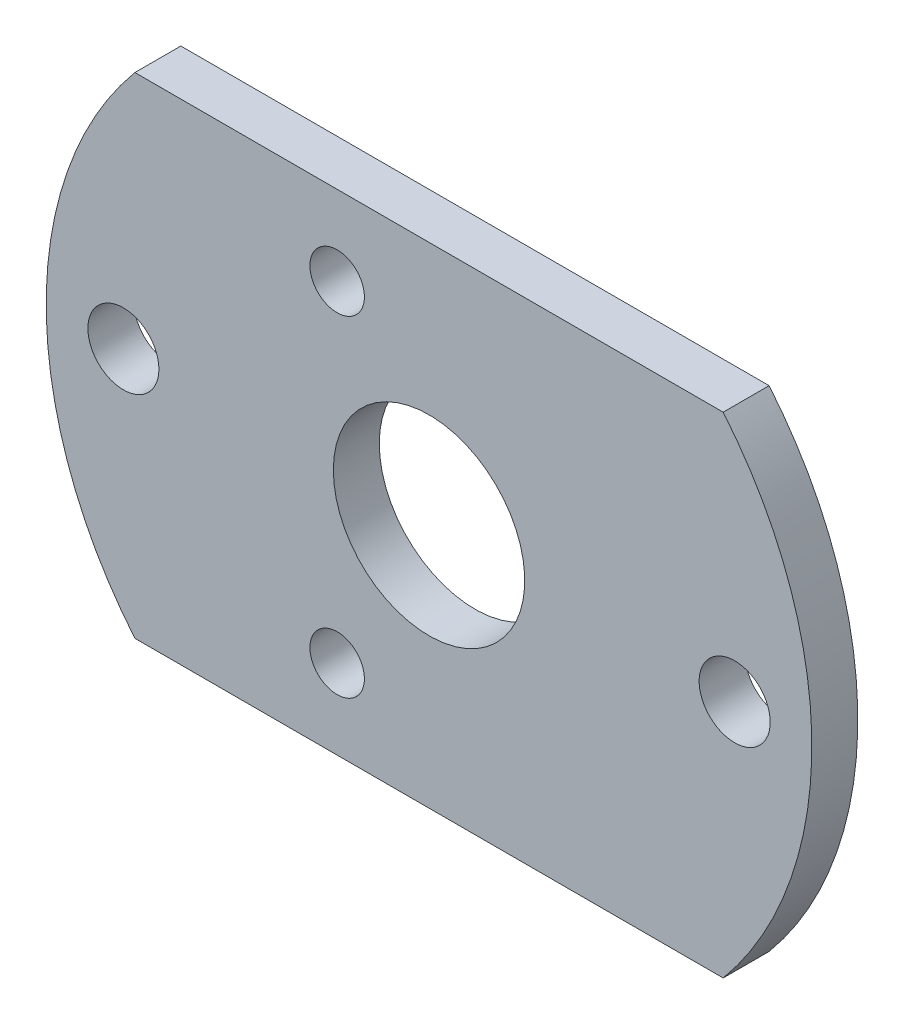
ISO-10303-21;
HEADER;
FILE_DESCRIPTION(('STEP AP214'),'2;1');
FILE_NAME('part.step','',(''),(''),'','','');
FILE_SCHEMA(('AUTOMOTIVE_DESIGN { 1 0 10303 214 1 1 1 1 }'));
ENDSEC;
DATA;
#1=APPLICATION_CONTEXT('core data for automotive mechanical design processes');
#2=APPLICATION_PROTOCOL_DEFINITION('international standard','automotive_design',2000,#1);
#3=PRODUCT_CONTEXT('',#1,'mechanical');
#4=PRODUCT('Part','Part','',(#3));
#5=PRODUCT_RELATED_PRODUCT_CATEGORY('part','',(#4));
#6=PRODUCT_DEFINITION_FORMATION('','',#4);
#7=PRODUCT_DEFINITION_CONTEXT('part definition',#1,'design');
#8=PRODUCT_DEFINITION('design','',#6,#7);
#9=PRODUCT_DEFINITION_SHAPE('','',#8);
#10=(LENGTH_UNIT() NAMED_UNIT(*) SI_UNIT(.MILLI.,.METRE.));
#11=(NAMED_UNIT(*) PLANE_ANGLE_UNIT() SI_UNIT($,.RADIAN.));
#12=(NAMED_UNIT(*) SI_UNIT($,.STERADIAN.) SOLID_ANGLE_UNIT());
#13=UNCERTAINTY_MEASURE_WITH_UNIT(LENGTH_MEASURE(1.E-05),#10,'distance_accuracy_value','');
#14=(GEOMETRIC_REPRESENTATION_CONTEXT(3) GLOBAL_UNCERTAINTY_ASSIGNED_CONTEXT((#13)) GLOBAL_UNIT_ASSIGNED_CONTEXT((#10,
#11,#12)) REPRESENTATION_CONTEXT('',''));
#15=CARTESIAN_POINT('',(0.,0.,0.));
#16=DIRECTION('',(0.,0.,1.));
#17=DIRECTION('',(1.,0.,0.));
#18=AXIS2_PLACEMENT_3D('',#15,#16,#17);
#19=CARTESIAN_POINT('',(0.,0.,1.905));
#20=DIRECTION('',(0.,0.,-1.));
#21=DIRECTION('',(-1.,0.,0.));
#22=AXIS2_PLACEMENT_3D('',#19,#20,#21);
#23=CYLINDRICAL_SURFACE('',#22,15.875);
#24=CARTESIAN_POINT('',(0.,0.,1.905));
#25=DIRECTION('',(0.,0.,1.));
#26=DIRECTION('',(1.,0.,0.));
#27=AXIS2_PLACEMENT_3D('',#24,#25,#26);
#28=CIRCLE('',#27,15.875);
#29=CARTESIAN_POINT('',(-12.1979516723096,10.16,1.905));
#30=VERTEX_POINT('',#29);
#31=CARTESIAN_POINT('',(-12.1979516723096,-10.16,1.905));
#32=VERTEX_POINT('',#31);
#33=EDGE_CURVE('E44',#30,#32,#28,.T.);
#34=ORIENTED_EDGE('',*,*,#33,.F.);
#35=DIRECTION('',(0.,0.,1.));
#36=VECTOR('',#35,1.);
#37=CARTESIAN_POINT('',(-12.1979516723096,10.16,0.));
#38=LINE('',#37,#36);
#39=CARTESIAN_POINT('',(-12.1979516723096,10.16,0.));
#40=VERTEX_POINT('',#39);
#41=EDGE_CURVE('E78',#40,#30,#38,.T.);
#42=ORIENTED_EDGE('',*,*,#41,.F.);
#43=CARTESIAN_POINT('',(0.,0.,0.));
#44=DIRECTION('',(0.,0.,1.));
#45=DIRECTION('',(1.,0.,0.));
#46=AXIS2_PLACEMENT_3D('',#43,#44,#45);
#47=CIRCLE('',#46,15.875);
#48=CARTESIAN_POINT('',(-12.1979516723096,-10.16,0.));
#49=VERTEX_POINT('',#48);
#50=EDGE_CURVE('E87',#40,#49,#47,.T.);
#51=ORIENTED_EDGE('',*,*,#50,.T.);
#52=DIRECTION('',(0.,0.,1.));
#53=VECTOR('',#52,1.);
#54=CARTESIAN_POINT('',(-12.1979516723096,-10.16,0.));
#55=LINE('',#54,#53);
#56=EDGE_CURVE('E127',#49,#32,#55,.T.);
#57=ORIENTED_EDGE('',*,*,#56,.T.);
#58=EDGE_LOOP('',(#34,#42,#51,#57));
#59=FACE_BOUND('',#58,.T.);
#60=ADVANCED_FACE('F35',(#59),#23,.T.);
#61=CARTESIAN_POINT('',(0.,0.,1.905));
#62=DIRECTION('',(0.,0.,1.));
#63=DIRECTION('',(1.,0.,0.));
#64=AXIS2_PLACEMENT_3D('',#61,#62,#63);
#65=PLANE('',#64);
#66=DIRECTION('',(1.,0.,0.));
#67=VECTOR('',#66,1.);
#68=CARTESIAN_POINT('',(-12.1979516723096,10.16,1.905));
#69=LINE('',#68,#67);
#70=CARTESIAN_POINT('',(12.1979516723096,10.16,1.905));
#71=VERTEX_POINT('',#70);
#72=EDGE_CURVE('E51',#30,#71,#69,.T.);
#73=ORIENTED_EDGE('',*,*,#72,.F.);
#74=ORIENTED_EDGE('',*,*,#33,.T.);
#75=DIRECTION('',(-1.,0.,0.));
#76=VECTOR('',#75,1.);
#77=CARTESIAN_POINT('',(-12.1979516723096,-10.16,1.905));
#78=LINE('',#77,#76);
#79=CARTESIAN_POINT('',(12.1979516723096,-10.16,1.905));
#80=VERTEX_POINT('',#79);
#81=EDGE_CURVE('E131',#80,#32,#78,.T.);
#82=ORIENTED_EDGE('',*,*,#81,.F.);
#83=EDGE_CURVE('E11',#80,#71,#28,.T.);
#84=ORIENTED_EDGE('',*,*,#83,.T.);
#85=EDGE_LOOP('',(#73,#74,#82,#84));
#86=FACE_BOUND('',#85,.T.);
#87=CARTESIAN_POINT('',(-3.81,6.858,1.905));
#88=DIRECTION('',(0.,0.,1.));
#89=DIRECTION('',(1.,0.,0.));
#90=AXIS2_PLACEMENT_3D('',#87,#88,#89);
#91=CIRCLE('',#90,1.13029999999999);
#92=CARTESIAN_POINT('',(-2.67970000000001,6.858,1.905));
#93=VERTEX_POINT('',#92);
#94=EDGE_CURVE('E124',#93,#93,#91,.T.);
#95=ORIENTED_EDGE('',*,*,#94,.F.);
#96=EDGE_LOOP('',(#95));
#97=FACE_BOUND('',#96,.T.);
#98=CARTESIAN_POINT('',(-3.81,-6.858,1.905));
#99=DIRECTION('',(0.,0.,1.));
#100=DIRECTION('',(1.,0.,0.));
#101=AXIS2_PLACEMENT_3D('',#98,#99,#100);
#102=CIRCLE('',#101,1.13029999999999);
#103=CARTESIAN_POINT('',(-2.67970000000001,-6.858,1.905));
#104=VERTEX_POINT('',#103);
#105=EDGE_CURVE('E118',#104,#104,#102,.T.);
#106=ORIENTED_EDGE('',*,*,#105,.F.);
#107=EDGE_LOOP('',(#106));
#108=FACE_BOUND('',#107,.T.);
#109=CARTESIAN_POINT('',(-12.6746,0.,1.905));
#110=DIRECTION('',(0.,0.,1.));
#111=DIRECTION('',(1.,0.,0.));
#112=AXIS2_PLACEMENT_3D('',#109,#110,#111);
#113=CIRCLE('',#112,1.47319999999999);
#114=CARTESIAN_POINT('',(-11.2014,0.,1.905));
#115=VERTEX_POINT('',#114);
#116=EDGE_CURVE('E112',#115,#115,#113,.T.);
#117=ORIENTED_EDGE('',*,*,#116,.F.);
#118=EDGE_LOOP('',(#117));
#119=FACE_BOUND('',#118,.T.);
#120=CARTESIAN_POINT('',(12.6746,0.,1.905));
#121=DIRECTION('',(0.,0.,1.));
#122=DIRECTION('',(1.,0.,0.));
#123=AXIS2_PLACEMENT_3D('',#120,#121,#122);
#124=CIRCLE('',#123,1.47319999999999);
#125=CARTESIAN_POINT('',(14.1478,0.,1.905));
#126=VERTEX_POINT('',#125);
#127=EDGE_CURVE('E106',#126,#126,#124,.T.);
#128=ORIENTED_EDGE('',*,*,#127,.F.);
#129=EDGE_LOOP('',(#128));
#130=FACE_BOUND('',#129,.T.);
#131=CARTESIAN_POINT('',(0.,0.,1.905));
#132=DIRECTION('',(0.,0.,1.));
#133=DIRECTION('',(1.,0.,0.));
#134=AXIS2_PLACEMENT_3D('',#131,#132,#133);
#135=CIRCLE('',#134,3.96875);
#136=CARTESIAN_POINT('',(-3.96875,0.,1.905));
#137=VERTEX_POINT('',#136);
#138=EDGE_CURVE('E94',#137,#137,#135,.T.);
#139=ORIENTED_EDGE('',*,*,#138,.F.);
#140=EDGE_LOOP('',(#139));
#141=FACE_BOUND('',#140,.T.);
#142=ADVANCED_FACE('F138',(#86,#97,#108,#119,#130,#141),#65,.T.);
#143=CARTESIAN_POINT('',(0.,0.,0.));
#144=DIRECTION('',(0.,0.,1.));
#145=DIRECTION('',(1.,0.,0.));
#146=AXIS2_PLACEMENT_3D('',#143,#144,#145);
#147=PLANE('',#146);
#148=CARTESIAN_POINT('',(-3.81,6.858,0.));
#149=DIRECTION('',(0.,0.,1.));
#150=DIRECTION('',(1.,0.,0.));
#151=AXIS2_PLACEMENT_3D('',#148,#149,#150);
#152=CIRCLE('',#151,1.1303);
#153=CARTESIAN_POINT('',(-2.6797,6.858,0.));
#154=VERTEX_POINT('',#153);
#155=EDGE_CURVE('E121',#154,#154,#152,.T.);
#156=ORIENTED_EDGE('',*,*,#155,.T.);
#157=EDGE_LOOP('',(#156));
#158=FACE_BOUND('',#157,.T.);
#159=CARTESIAN_POINT('',(-3.81,-6.858,0.));
#160=DIRECTION('',(0.,0.,1.));
#161=DIRECTION('',(1.,0.,0.));
#162=AXIS2_PLACEMENT_3D('',#159,#160,#161);
#163=CIRCLE('',#162,1.1303);
#164=CARTESIAN_POINT('',(-2.6797,-6.858,0.));
#165=VERTEX_POINT('',#164);
#166=EDGE_CURVE('E115',#165,#165,#163,.T.);
#167=ORIENTED_EDGE('',*,*,#166,.T.);
#168=EDGE_LOOP('',(#167));
#169=FACE_BOUND('',#168,.T.);
#170=CARTESIAN_POINT('',(-12.6746,0.,0.));
#171=DIRECTION('',(0.,0.,1.));
#172=DIRECTION('',(1.,0.,0.));
#173=AXIS2_PLACEMENT_3D('',#170,#171,#172);
#174=CIRCLE('',#173,1.4732);
#175=CARTESIAN_POINT('',(-11.2014,0.,0.));
#176=VERTEX_POINT('',#175);
#177=EDGE_CURVE('E109',#176,#176,#174,.T.);
#178=ORIENTED_EDGE('',*,*,#177,.T.);
#179=EDGE_LOOP('',(#178));
#180=FACE_BOUND('',#179,.T.);
#181=CARTESIAN_POINT('',(12.6746,0.,0.));
#182=DIRECTION('',(0.,0.,1.));
#183=DIRECTION('',(1.,0.,0.));
#184=AXIS2_PLACEMENT_3D('',#181,#182,#183);
#185=CIRCLE('',#184,1.4732);
#186=CARTESIAN_POINT('',(14.1478,0.,0.));
#187=VERTEX_POINT('',#186);
#188=EDGE_CURVE('E101',#187,#187,#185,.T.);
#189=ORIENTED_EDGE('',*,*,#188,.T.);
#190=EDGE_LOOP('',(#189));
#191=FACE_BOUND('',#190,.T.);
#192=ORIENTED_EDGE('',*,*,#50,.F.);
#193=DIRECTION('',(1.,0.,0.));
#194=VECTOR('',#193,1.);
#195=CARTESIAN_POINT('',(-12.1979516723096,10.16,0.));
#196=LINE('',#195,#194);
#197=CARTESIAN_POINT('',(12.1979516723096,10.16,0.));
#198=VERTEX_POINT('',#197);
#199=EDGE_CURVE('E75',#40,#198,#196,.T.);
#200=ORIENTED_EDGE('',*,*,#199,.T.);
#201=CARTESIAN_POINT('',(12.1979516723096,-10.16,0.));
#202=VERTEX_POINT('',#201);
#203=EDGE_CURVE('E39',#202,#198,#47,.T.);
#204=ORIENTED_EDGE('',*,*,#203,.F.);
#205=DIRECTION('',(-1.,0.,0.));
#206=VECTOR('',#205,1.);
#207=CARTESIAN_POINT('',(-12.1979516723096,-10.16,0.));
#208=LINE('',#207,#206);
#209=EDGE_CURVE('E93',#202,#49,#208,.T.);
#210=ORIENTED_EDGE('',*,*,#209,.T.);
#211=EDGE_LOOP('',(#192,#200,#204,#210));
#212=FACE_BOUND('',#211,.T.);
#213=CARTESIAN_POINT('',(0.,0.,0.));
#214=DIRECTION('',(0.,0.,1.));
#215=DIRECTION('',(1.,0.,0.));
#216=AXIS2_PLACEMENT_3D('',#213,#214,#215);
#217=CIRCLE('',#216,3.96875);
#218=CARTESIAN_POINT('',(-3.96875,0.,0.));
#219=VERTEX_POINT('',#218);
#220=EDGE_CURVE('E96',#219,#219,#217,.T.);
#221=ORIENTED_EDGE('',*,*,#220,.T.);
#222=EDGE_LOOP('',(#221));
#223=FACE_BOUND('',#222,.T.);
#224=ADVANCED_FACE('F91',(#158,#169,#180,#191,#212,#223),#147,.F.);
#225=ORIENTED_EDGE('',*,*,#203,.T.);
#226=DIRECTION('',(0.,0.,1.));
#227=VECTOR('',#226,1.);
#228=CARTESIAN_POINT('',(12.1979516723096,10.16,0.));
#229=LINE('',#228,#227);
#230=EDGE_CURVE('E79',#198,#71,#229,.T.);
#231=ORIENTED_EDGE('',*,*,#230,.T.);
#232=ORIENTED_EDGE('',*,*,#83,.F.);
#233=DIRECTION('',(0.,0.,1.));
#234=VECTOR('',#233,1.);
#235=CARTESIAN_POINT('',(12.1979516723096,-10.16,0.));
#236=LINE('',#235,#234);
#237=EDGE_CURVE('E128',#202,#80,#236,.T.);
#238=ORIENTED_EDGE('',*,*,#237,.F.);
#239=EDGE_LOOP('',(#225,#231,#232,#238));
#240=FACE_BOUND('',#239,.T.);
#241=ADVANCED_FACE('F37',(#240),#23,.T.);
#242=CARTESIAN_POINT('',(0.,0.,1.905));
#243=DIRECTION('',(0.,0.,-1.));
#244=DIRECTION('',(-1.,0.,0.));
#245=AXIS2_PLACEMENT_3D('',#242,#243,#244);
#246=CYLINDRICAL_SURFACE('',#245,3.96875);
#247=CARTESIAN_POINT('',(-3.96875,0.,1.905));
#248=CARTESIAN_POINT('',(-3.96875,0.,1.88515625));
#249=CARTESIAN_POINT('',(-3.96875,0.,1.8653125));
#250=CARTESIAN_POINT('',(-3.96875,0.,1.825625));
#251=CARTESIAN_POINT('',(-3.96875,0.,1.80578125));
#252=CARTESIAN_POINT('',(-3.96875,0.,1.76609375));
#253=CARTESIAN_POINT('',(-3.96875,0.,1.74625));
#254=CARTESIAN_POINT('',(-3.96875,0.,1.7065625));
#255=CARTESIAN_POINT('',(-3.96875,0.,1.68671875));
#256=CARTESIAN_POINT('',(-3.96875,0.,1.64703125));
#257=CARTESIAN_POINT('',(-3.96875,0.,1.6271875));
#258=CARTESIAN_POINT('',(-3.96875,0.,1.5875));
#259=CARTESIAN_POINT('',(-3.96875,0.,1.56765625));
#260=CARTESIAN_POINT('',(-3.96875,0.,1.52796875));
#261=CARTESIAN_POINT('',(-3.96875,0.,1.508125));
#262=CARTESIAN_POINT('',(-3.96875,0.,1.4684375));
#263=CARTESIAN_POINT('',(-3.96875,0.,1.44859375));
#264=CARTESIAN_POINT('',(-3.96875,0.,1.40890625));
#265=CARTESIAN_POINT('',(-3.96875,0.,1.3890625));
#266=CARTESIAN_POINT('',(-3.96875,0.,1.349375));
#267=CARTESIAN_POINT('',(-3.96875,0.,1.32953125));
#268=CARTESIAN_POINT('',(-3.96875,0.,1.28984375));
#269=CARTESIAN_POINT('',(-3.96875,0.,1.27));
#270=CARTESIAN_POINT('',(-3.96875,0.,1.2303125));
#271=CARTESIAN_POINT('',(-3.96875,0.,1.21046875));
#272=CARTESIAN_POINT('',(-3.96875,0.,1.17078125));
#273=CARTESIAN_POINT('',(-3.96875,0.,1.1509375));
#274=CARTESIAN_POINT('',(-3.96875,0.,1.11125));
#275=CARTESIAN_POINT('',(-3.96875,0.,1.09140625));
#276=CARTESIAN_POINT('',(-3.96875,0.,1.05171875));
#277=CARTESIAN_POINT('',(-3.96875,0.,1.031875));
#278=CARTESIAN_POINT('',(-3.96875,0.,0.9921875));
#279=CARTESIAN_POINT('',(-3.96875,0.,0.97234375));
#280=CARTESIAN_POINT('',(-3.96875,0.,0.93265625));
#281=CARTESIAN_POINT('',(-3.96875,0.,0.9128125));
#282=CARTESIAN_POINT('',(-3.96875,0.,0.873125));
#283=CARTESIAN_POINT('',(-3.96875,0.,0.85328125));
#284=CARTESIAN_POINT('',(-3.96875,0.,0.81359375));
#285=CARTESIAN_POINT('',(-3.96875,0.,0.79375));
#286=CARTESIAN_POINT('',(-3.96875,0.,0.7540625));
#287=CARTESIAN_POINT('',(-3.96875,0.,0.73421875));
#288=CARTESIAN_POINT('',(-3.96875,0.,0.69453125));
#289=CARTESIAN_POINT('',(-3.96875,0.,0.6746875));
#290=CARTESIAN_POINT('',(-3.96875,0.,0.635));
#291=CARTESIAN_POINT('',(-3.96875,0.,0.61515625));
#292=CARTESIAN_POINT('',(-3.96875,0.,0.57546875));
#293=CARTESIAN_POINT('',(-3.96875,0.,0.555625));
#294=CARTESIAN_POINT('',(-3.96875,0.,0.5159375));
#295=CARTESIAN_POINT('',(-3.96875,0.,0.49609375));
#296=CARTESIAN_POINT('',(-3.96875,0.,0.45640625));
#297=CARTESIAN_POINT('',(-3.96875,0.,0.4365625));
#298=CARTESIAN_POINT('',(-3.96875,0.,0.396875));
#299=CARTESIAN_POINT('',(-3.96875,0.,0.37703125));
#300=CARTESIAN_POINT('',(-3.96875,0.,0.33734375));
#301=CARTESIAN_POINT('',(-3.96875,0.,0.3175));
#302=CARTESIAN_POINT('',(-3.96875,0.,0.2778125));
#303=CARTESIAN_POINT('',(-3.96875,0.,0.25796875));
#304=CARTESIAN_POINT('',(-3.96875,0.,0.21828125));
#305=CARTESIAN_POINT('',(-3.96875,0.,0.1984375));
#306=CARTESIAN_POINT('',(-3.96875,0.,0.15875));
#307=CARTESIAN_POINT('',(-3.96875,0.,0.13890625));
#308=CARTESIAN_POINT('',(-3.96875,0.,0.09921875));
#309=CARTESIAN_POINT('',(-3.96875,0.,0.0793749999999999));
#310=CARTESIAN_POINT('',(-3.96875,0.,0.0396874999999999));
#311=CARTESIAN_POINT('',(-3.96875,0.,0.01984375));
#312=CARTESIAN_POINT('',(-3.96875,0.,0.));
#313=B_SPLINE_CURVE_WITH_KNOTS('',3,(#247,#248,#249,#250,#251,#252,#253,#254,#255,#256,#257,
#258,#259,#260,#261,#262,#263,#264,#265,#266,#267,#268,#269,#270,#271,#272,#273,#274,#275,#276,
#277,#278,#279,#280,#281,#282,#283,#284,#285,#286,#287,#288,#289,#290,#291,#292,#293,#294,#295,
#296,#297,#298,#299,#300,#301,#302,#303,#304,#305,#306,#307,#308,#309,#310,#311,#312),
.UNSPECIFIED.,.F.,.F.,(4,2,2,2,2,2,2,2,2,2,2,2,2,2,2,2,2,2,2,2,2,2,2,2,2,2,2,2,2,2,2,2,4),(0.,
0.0595312499999999,0.1190625,0.17859375,0.238125,0.29765625,0.3571875,0.41671875,0.47625,
0.53578125,0.5953125,0.65484375,0.714375,0.77390625,0.833437499999999,0.89296875,0.9525,
1.01203125,1.0715625,1.13109375,1.190625,1.25015625,1.3096875,1.36921875,1.42875,1.48828125,
1.5478125,1.60734375,1.666875,1.72640625,1.7859375,1.84546875,1.905),.UNSPECIFIED.);
#314=EDGE_CURVE('BSEAM159',#137,#219,#313,.T.);
#315=ORIENTED_EDGE('',*,*,#138,.T.);
#316=ORIENTED_EDGE('',*,*,#220,.F.);
#317=ORIENTED_EDGE('',*,*,#314,.T.);
#318=ORIENTED_EDGE('',*,*,#314,.F.);
#319=EDGE_LOOP('',(#315,#317,#316,#318));
#320=FACE_BOUND('',#319,.T.);
#321=ADVANCED_FACE('F159',(#320),#246,.F.);
#322=CARTESIAN_POINT('',(12.6746,0.,1.905));
#323=DIRECTION('',(0.,0.,1.));
#324=DIRECTION('',(1.,0.,0.));
#325=AXIS2_PLACEMENT_3D('',#322,#323,#324);
#326=CYLINDRICAL_SURFACE('',#325,1.47319999999999);
#327=ORIENTED_EDGE('',*,*,#188,.F.);
#328=EDGE_LOOP('',(#327));
#329=FACE_BOUND('',#328,.T.);
#330=ORIENTED_EDGE('',*,*,#127,.T.);
#331=EDGE_LOOP('',(#330));
#332=FACE_BOUND('',#331,.T.);
#333=ADVANCED_FACE('F164',(#329,#332),#326,.F.);
#334=CARTESIAN_POINT('',(-12.6746,0.,1.905));
#335=DIRECTION('',(0.,0.,1.));
#336=DIRECTION('',(1.,0.,0.));
#337=AXIS2_PLACEMENT_3D('',#334,#335,#336);
#338=CYLINDRICAL_SURFACE('',#337,1.47319999999999);
#339=ORIENTED_EDGE('',*,*,#177,.F.);
#340=EDGE_LOOP('',(#339));
#341=FACE_BOUND('',#340,.T.);
#342=ORIENTED_EDGE('',*,*,#116,.T.);
#343=EDGE_LOOP('',(#342));
#344=FACE_BOUND('',#343,.T.);
#345=ADVANCED_FACE('F173',(#341,#344),#338,.F.);
#346=CARTESIAN_POINT('',(-3.81,-6.858,1.905));
#347=DIRECTION('',(0.,0.,1.));
#348=DIRECTION('',(1.,0.,0.));
#349=AXIS2_PLACEMENT_3D('',#346,#347,#348);
#350=CYLINDRICAL_SURFACE('',#349,1.13029999999999);
#351=ORIENTED_EDGE('',*,*,#166,.F.);
#352=EDGE_LOOP('',(#351));
#353=FACE_BOUND('',#352,.T.);
#354=ORIENTED_EDGE('',*,*,#105,.T.);
#355=EDGE_LOOP('',(#354));
#356=FACE_BOUND('',#355,.T.);
#357=ADVANCED_FACE('F150',(#353,#356),#350,.F.);
#358=CARTESIAN_POINT('',(-3.81,6.858,1.905));
#359=DIRECTION('',(0.,0.,1.));
#360=DIRECTION('',(1.,0.,0.));
#361=AXIS2_PLACEMENT_3D('',#358,#359,#360);
#362=CYLINDRICAL_SURFACE('',#361,1.13029999999999);
#363=ORIENTED_EDGE('',*,*,#155,.F.);
#364=EDGE_LOOP('',(#363));
#365=FACE_BOUND('',#364,.T.);
#366=ORIENTED_EDGE('',*,*,#94,.T.);
#367=EDGE_LOOP('',(#366));
#368=FACE_BOUND('',#367,.T.);
#369=ADVANCED_FACE('F143',(#365,#368),#362,.F.);
#370=CARTESIAN_POINT('',(-12.1979516723096,-10.16,0.));
#371=DIRECTION('',(0.,1.,0.));
#372=DIRECTION('',(0.,0.,1.));
#373=AXIS2_PLACEMENT_3D('',#370,#371,#372);
#374=PLANE('',#373);
#375=ORIENTED_EDGE('',*,*,#81,.T.);
#376=ORIENTED_EDGE('',*,*,#56,.F.);
#377=ORIENTED_EDGE('',*,*,#209,.F.);
#378=ORIENTED_EDGE('',*,*,#237,.T.);
#379=EDGE_LOOP('',(#375,#376,#377,#378));
#380=FACE_BOUND('',#379,.T.);
#381=ADVANCED_FACE('F141',(#380),#374,.F.);
#382=CARTESIAN_POINT('',(-12.1979516723096,10.16,0.));
#383=DIRECTION('',(0.,-1.,0.));
#384=DIRECTION('',(0.,0.,-1.));
#385=AXIS2_PLACEMENT_3D('',#382,#383,#384);
#386=PLANE('',#385);
#387=ORIENTED_EDGE('',*,*,#72,.T.);
#388=ORIENTED_EDGE('',*,*,#230,.F.);
#389=ORIENTED_EDGE('',*,*,#199,.F.);
#390=ORIENTED_EDGE('',*,*,#41,.T.);
#391=EDGE_LOOP('',(#387,#388,#389,#390));
#392=FACE_BOUND('',#391,.T.);
#393=ADVANCED_FACE('F77',(#392),#386,.F.);
#394=CLOSED_SHELL('',(#60,#142,#224,#241,#321,#333,#345,#357,#369,#381,#393));
#395=MANIFOLD_SOLID_BREP('B2',#394);
#396=ADVANCED_BREP_SHAPE_REPRESENTATION('',(#18,#395),#14);
#397=SHAPE_DEFINITION_REPRESENTATION(#9,#396);
ENDSEC;
END-ISO-10303-21;
